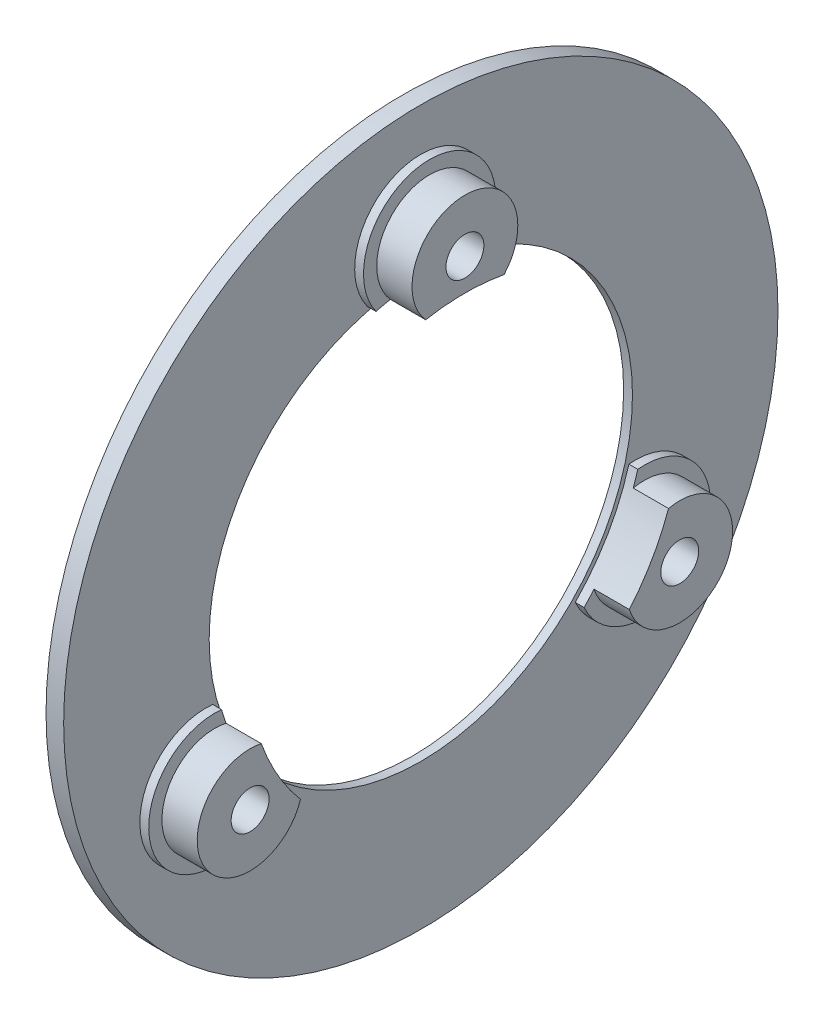
ISO-10303-21;
HEADER;
FILE_DESCRIPTION(('STEP AP214'),'2;1');
FILE_NAME('part.step','',(''),(''),'','','');
FILE_SCHEMA(('AUTOMOTIVE_DESIGN { 1 0 10303 214 1 1 1 1 }'));
ENDSEC;
DATA;
#1=APPLICATION_CONTEXT('core data for automotive mechanical design processes');
#2=APPLICATION_PROTOCOL_DEFINITION('international standard','automotive_design',2000,#1);
#3=PRODUCT_CONTEXT('',#1,'mechanical');
#4=PRODUCT('Part','Part','',(#3));
#5=PRODUCT_RELATED_PRODUCT_CATEGORY('part','',(#4));
#6=PRODUCT_DEFINITION_FORMATION('','',#4);
#7=PRODUCT_DEFINITION_CONTEXT('part definition',#1,'design');
#8=PRODUCT_DEFINITION('design','',#6,#7);
#9=PRODUCT_DEFINITION_SHAPE('','',#8);
#10=(LENGTH_UNIT() NAMED_UNIT(*) SI_UNIT(.MILLI.,.METRE.));
#11=(NAMED_UNIT(*) PLANE_ANGLE_UNIT() SI_UNIT($,.RADIAN.));
#12=(NAMED_UNIT(*) SI_UNIT($,.STERADIAN.) SOLID_ANGLE_UNIT());
#13=UNCERTAINTY_MEASURE_WITH_UNIT(LENGTH_MEASURE(1.E-05),#10,'distance_accuracy_value','');
#14=(GEOMETRIC_REPRESENTATION_CONTEXT(3) GLOBAL_UNCERTAINTY_ASSIGNED_CONTEXT((#13)) GLOBAL_UNIT_ASSIGNED_CONTEXT((#10,
#11,#12)) REPRESENTATION_CONTEXT('',''));
#15=CARTESIAN_POINT('',(0.,0.,0.));
#16=DIRECTION('',(0.,0.,1.));
#17=DIRECTION('',(1.,0.,0.));
#18=AXIS2_PLACEMENT_3D('',#15,#16,#17);
#19=CARTESIAN_POINT('',(-68.2964645562817,0.,0.));
#20=DIRECTION('',(1.,0.,0.));
#21=DIRECTION('',(0.,0.,-1.));
#22=AXIS2_PLACEMENT_3D('',#19,#20,#21);
#23=CYLINDRICAL_SURFACE('',#22,24.);
#24=CARTESIAN_POINT('',(1.,0.,0.));
#25=DIRECTION('',(1.,0.,0.));
#26=DIRECTION('',(0.,0.,-1.));
#27=AXIS2_PLACEMENT_3D('',#24,#25,#26);
#28=CIRCLE('',#27,24.);
#29=CARTESIAN_POINT('',(1.,0.,-24.));
#30=VERTEX_POINT('',#29);
#31=EDGE_CURVE('E371',#30,#30,#28,.F.);
#32=ORIENTED_EDGE('',*,*,#31,.T.);
#33=EDGE_LOOP('',(#32));
#34=FACE_BOUND('',#33,.T.);
#35=CARTESIAN_POINT('',(2.,0.,0.));
#36=DIRECTION('',(1.,0.,0.));
#37=DIRECTION('',(0.,0.,-1.));
#38=AXIS2_PLACEMENT_3D('',#35,#36,#37);
#39=CIRCLE('',#38,24.);
#40=CARTESIAN_POINT('',(2.,0.,-24.));
#41=VERTEX_POINT('',#40);
#42=EDGE_CURVE('E276',#41,#41,#39,.F.);
#43=ORIENTED_EDGE('',*,*,#42,.F.);
#44=EDGE_LOOP('',(#43));
#45=FACE_BOUND('',#44,.T.);
#46=ADVANCED_FACE('F158',(#34,#45),#23,.F.);
#47=CARTESIAN_POINT('',(3.,14.0625,0.));
#48=DIRECTION('',(1.,0.,0.));
#49=DIRECTION('',(0.,0.,-1.));
#50=AXIS2_PLACEMENT_3D('',#47,#48,#49);
#51=PLANE('',#50);
#52=CARTESIAN_POINT('',(3.,-14.0625,-24.3569644814373));
#53=DIRECTION('',(1.,0.,0.));
#54=DIRECTION('',(0.,0.,-1.));
#55=AXIS2_PLACEMENT_3D('',#52,#53,#54);
#56=CIRCLE('',#55,7.50000000000014);
#57=CARTESIAN_POINT('',(3.,-17.1321904151749,-17.5139387796746));
#58=VERTEX_POINT('',#57);
#59=CARTESIAN_POINT('',(3.,-6.6014206959362,-23.593881511851));
#60=VERTEX_POINT('',#59);
#61=EDGE_CURVE('E299',#58,#60,#56,.T.);
#62=ORIENTED_EDGE('',*,*,#61,.T.);
#63=CARTESIAN_POINT('',(3.,0.,0.));
#64=DIRECTION('',(1.,0.,0.));
#65=DIRECTION('',(0.,0.,-1.));
#66=AXIS2_PLACEMENT_3D('',#63,#64,#65);
#67=CIRCLE('',#66,24.5);
#68=CARTESIAN_POINT('',(3.,-8.19830874252486,-23.0876099621039));
#69=VERTEX_POINT('',#68);
#70=EDGE_CURVE('E452',#60,#69,#67,.F.);
#71=ORIENTED_EDGE('',*,*,#70,.T.);
#72=CARTESIAN_POINT('',(3.,-14.0625,-24.3569644814373));
#73=DIRECTION('',(1.,0.,0.));
#74=DIRECTION('',(0.,0.,-1.));
#75=AXIS2_PLACEMENT_3D('',#72,#73,#74);
#76=CIRCLE('',#75,6.);
#77=CARTESIAN_POINT('',(3.,-15.8953023685863,-18.6437486201465));
#78=VERTEX_POINT('',#77);
#79=EDGE_CURVE('E296',#78,#69,#76,.T.);
#80=ORIENTED_EDGE('',*,*,#79,.F.);
#81=EDGE_CURVE('E455',#78,#58,#67,.F.);
#82=ORIENTED_EDGE('',*,*,#81,.T.);
#83=EDGE_LOOP('',(#62,#71,#80,#82));
#84=FACE_BOUND('',#83,.T.);
#85=ADVANCED_FACE('F422',(#84),#51,.T.);
#86=CARTESIAN_POINT('',(3.,-14.0625,24.3569644814373));
#87=DIRECTION('',(1.,0.,0.));
#88=DIRECTION('',(0.,0.,-1.));
#89=AXIS2_PLACEMENT_3D('',#86,#87,#88);
#90=CIRCLE('',#89,7.50000000000028);
#91=CARTESIAN_POINT('',(3.,-6.60142069593605,23.5938815118511));
#92=VERTEX_POINT('',#91);
#93=CARTESIAN_POINT('',(3.,-17.132190415175,17.5139387796745));
#94=VERTEX_POINT('',#93);
#95=EDGE_CURVE('E460',#92,#94,#90,.T.);
#96=ORIENTED_EDGE('',*,*,#95,.T.);
#97=CARTESIAN_POINT('',(3.,-15.8953023685863,18.6437486201465));
#98=VERTEX_POINT('',#97);
#99=EDGE_CURVE('E480',#94,#98,#67,.F.);
#100=ORIENTED_EDGE('',*,*,#99,.T.);
#101=CARTESIAN_POINT('',(3.,-14.0625,24.3569644814373));
#102=DIRECTION('',(1.,0.,0.));
#103=DIRECTION('',(0.,0.,-1.));
#104=AXIS2_PLACEMENT_3D('',#101,#102,#103);
#105=CIRCLE('',#104,6.);
#106=CARTESIAN_POINT('',(3.,-8.19830874252487,23.0876099621039));
#107=VERTEX_POINT('',#106);
#108=EDGE_CURVE('E454',#107,#98,#105,.T.);
#109=ORIENTED_EDGE('',*,*,#108,.F.);
#110=EDGE_CURVE('E481',#107,#92,#67,.F.);
#111=ORIENTED_EDGE('',*,*,#110,.T.);
#112=EDGE_LOOP('',(#96,#100,#109,#111));
#113=FACE_BOUND('',#112,.T.);
#114=ADVANCED_FACE('F550',(#113),#51,.T.);
#115=CARTESIAN_POINT('',(3.,28.125,0.));
#116=DIRECTION('',(1.,0.,0.));
#117=DIRECTION('',(0.,0.,-1.));
#118=AXIS2_PLACEMENT_3D('',#115,#116,#117);
#119=CIRCLE('',#118,7.5);
#120=CARTESIAN_POINT('',(3.,23.7336111111111,-6.07994273217628));
#121=VERTEX_POINT('',#120);
#122=CARTESIAN_POINT('',(3.,23.7336111111111,6.07994273217628));
#123=VERTEX_POINT('',#122);
#124=EDGE_CURVE('E284',#121,#123,#119,.T.);
#125=ORIENTED_EDGE('',*,*,#124,.T.);
#126=CARTESIAN_POINT('',(3.,24.0936111111111,4.44386134195738));
#127=VERTEX_POINT('',#126);
#128=EDGE_CURVE('E450',#123,#127,#67,.F.);
#129=ORIENTED_EDGE('',*,*,#128,.T.);
#130=CARTESIAN_POINT('',(3.,28.125,0.));
#131=DIRECTION('',(1.,0.,0.));
#132=DIRECTION('',(0.,0.,-1.));
#133=AXIS2_PLACEMENT_3D('',#130,#131,#132);
#134=CIRCLE('',#133,6.);
#135=CARTESIAN_POINT('',(3.,24.0936111111111,-4.44386134195738));
#136=VERTEX_POINT('',#135);
#137=EDGE_CURVE('E290',#136,#127,#134,.T.);
#138=ORIENTED_EDGE('',*,*,#137,.F.);
#139=EDGE_CURVE('E448',#136,#121,#67,.F.);
#140=ORIENTED_EDGE('',*,*,#139,.T.);
#141=EDGE_LOOP('',(#125,#129,#138,#140));
#142=FACE_BOUND('',#141,.T.);
#143=ADVANCED_FACE('F442',(#142),#51,.T.);
#144=CARTESIAN_POINT('',(2.,0.,0.));
#145=DIRECTION('',(1.,0.,0.));
#146=DIRECTION('',(0.,0.,-1.));
#147=AXIS2_PLACEMENT_3D('',#144,#145,#146);
#148=PLANE('',#147);
#149=CARTESIAN_POINT('',(2.,28.125,0.));
#150=DIRECTION('',(1.,0.,0.));
#151=DIRECTION('',(0.,0.,-1.));
#152=AXIS2_PLACEMENT_3D('',#149,#150,#151);
#153=CIRCLE('',#152,7.5);
#154=CARTESIAN_POINT('',(2.,23.7336111111111,-6.07994273217628));
#155=VERTEX_POINT('',#154);
#156=CARTESIAN_POINT('',(2.,23.7336111111111,6.07994273217628));
#157=VERTEX_POINT('',#156);
#158=EDGE_CURVE('E282',#155,#157,#153,.T.);
#159=ORIENTED_EDGE('',*,*,#158,.F.);
#160=CARTESIAN_POINT('',(2.,0.,0.));
#161=DIRECTION('',(1.,0.,0.));
#162=DIRECTION('',(0.,0.,-1.));
#163=AXIS2_PLACEMENT_3D('',#160,#161,#162);
#164=CIRCLE('',#163,24.5);
#165=EDGE_CURVE('E265',#155,#157,#164,.T.);
#166=ORIENTED_EDGE('',*,*,#165,.T.);
#167=EDGE_LOOP('',(#159,#166));
#168=FACE_BOUND('',#167,.T.);
#169=CARTESIAN_POINT('',(2.,-14.0625,24.3569644814373));
#170=DIRECTION('',(1.,0.,0.));
#171=DIRECTION('',(0.,0.,-1.));
#172=AXIS2_PLACEMENT_3D('',#169,#170,#171);
#173=CIRCLE('',#172,7.50000000000028);
#174=CARTESIAN_POINT('',(2.,-6.60142069593605,23.5938815118511));
#175=VERTEX_POINT('',#174);
#176=CARTESIAN_POINT('',(2.,-17.132190415175,17.5139387796745));
#177=VERTEX_POINT('',#176);
#178=EDGE_CURVE('E289',#175,#177,#173,.T.);
#179=ORIENTED_EDGE('',*,*,#178,.F.);
#180=EDGE_CURVE('E277',#175,#177,#164,.T.);
#181=ORIENTED_EDGE('',*,*,#180,.T.);
#182=EDGE_LOOP('',(#179,#181));
#183=FACE_BOUND('',#182,.T.);
#184=CARTESIAN_POINT('',(2.,0.,0.));
#185=DIRECTION('',(1.,0.,0.));
#186=DIRECTION('',(0.,0.,-1.));
#187=AXIS2_PLACEMENT_3D('',#184,#185,#186);
#188=CIRCLE('',#187,40.5);
#189=CARTESIAN_POINT('',(2.,0.,-40.5));
#190=VERTEX_POINT('',#189);
#191=EDGE_CURVE('E354',#190,#190,#188,.T.);
#192=ORIENTED_EDGE('',*,*,#191,.T.);
#193=EDGE_LOOP('',(#192));
#194=FACE_BOUND('',#193,.T.);
#195=CARTESIAN_POINT('',(2.,-17.1321904151749,-17.5139387796746));
#196=VERTEX_POINT('',#195);
#197=CARTESIAN_POINT('',(2.,-6.60142069593619,-23.593881511851));
#198=VERTEX_POINT('',#197);
#199=EDGE_CURVE('E175',#196,#198,#164,.T.);
#200=ORIENTED_EDGE('',*,*,#199,.T.);
#201=CARTESIAN_POINT('',(2.,-14.0625,-24.3569644814373));
#202=DIRECTION('',(1.,0.,0.));
#203=DIRECTION('',(0.,0.,-1.));
#204=AXIS2_PLACEMENT_3D('',#201,#202,#203);
#205=CIRCLE('',#204,7.50000000000014);
#206=EDGE_CURVE('E293',#196,#198,#205,.T.);
#207=ORIENTED_EDGE('',*,*,#206,.F.);
#208=EDGE_LOOP('',(#200,#207));
#209=FACE_BOUND('',#208,.T.);
#210=ORIENTED_EDGE('',*,*,#42,.T.);
#211=EDGE_LOOP('',(#210));
#212=FACE_BOUND('',#211,.T.);
#213=ADVANCED_FACE('F287',(#168,#183,#194,#209,#212),#148,.T.);
#214=CARTESIAN_POINT('',(3.,0.,0.));
#215=DIRECTION('',(-1.,0.,0.));
#216=DIRECTION('',(0.,0.,1.));
#217=AXIS2_PLACEMENT_3D('',#214,#215,#216);
#218=CYLINDRICAL_SURFACE('',#217,40.5);
#219=CARTESIAN_POINT('',(0.,0.,0.));
#220=DIRECTION('',(-1.,0.,0.));
#221=DIRECTION('',(0.,0.,1.));
#222=AXIS2_PLACEMENT_3D('',#219,#220,#221);
#223=CIRCLE('',#222,40.5);
#224=CARTESIAN_POINT('',(0.,0.,40.5));
#225=VERTEX_POINT('',#224);
#226=EDGE_CURVE('E374',#225,#225,#223,.T.);
#227=ORIENTED_EDGE('',*,*,#226,.F.);
#228=EDGE_LOOP('',(#227));
#229=FACE_BOUND('',#228,.T.);
#230=ORIENTED_EDGE('',*,*,#191,.F.);
#231=EDGE_LOOP('',(#230));
#232=FACE_BOUND('',#231,.T.);
#233=ADVANCED_FACE('F419',(#229,#232),#218,.T.);
#234=CARTESIAN_POINT('',(0.999999999999998,28.125,0.));
#235=DIRECTION('',(-1.,0.,0.));
#236=DIRECTION('',(0.,0.,1.));
#237=AXIS2_PLACEMENT_3D('',#234,#235,#236);
#238=CONICAL_SURFACE('',#237,3.15,0.785398163397452);
#239=CARTESIAN_POINT('',(0.999999999999998,28.125,0.));
#240=DIRECTION('',(-1.,0.,0.));
#241=DIRECTION('',(0.,0.,1.));
#242=AXIS2_PLACEMENT_3D('',#239,#240,#241);
#243=CIRCLE('',#242,3.15);
#244=CARTESIAN_POINT('',(0.999999999999998,28.4694363506901,-3.13111219861622));
#245=VERTEX_POINT('',#244);
#246=CARTESIAN_POINT('',(0.999999999999998,28.4694363506901,3.13111219861622));
#247=VERTEX_POINT('',#246);
#248=EDGE_CURVE('E369',#245,#247,#243,.T.);
#249=ORIENTED_EDGE('',*,*,#248,.T.);
#250=CARTESIAN_POINT('',(0.999999999999998,28.4694363506901,3.13111219861622));
#251=CARTESIAN_POINT('',(1.00001380500847,28.583681570066,3.11855716344337));
#252=CARTESIAN_POINT('',(0.998112234272037,28.6974429138037,3.10160114914846));
#253=CARTESIAN_POINT('',(0.990768358426493,28.923194948904,3.05888422252965));
#254=CARTESIAN_POINT('',(0.985325713704853,29.0351854693776,3.03312246578904));
#255=CARTESIAN_POINT('',(0.971168145233079,29.2569101140088,2.97270103761833));
#256=CARTESIAN_POINT('',(0.962443239756576,29.3666362672303,2.93801432713111));
#257=CARTESIAN_POINT('',(0.942121955381928,29.5826110210118,2.85988619102815));
#258=CARTESIAN_POINT('',(0.930525752332747,29.6888598340861,2.81644530158128));
#259=CARTESIAN_POINT('',(0.892161000868774,30.0005381921529,2.67343831996709));
#260=CARTESIAN_POINT('',(0.861753146041542,30.1997957692748,2.56094561763914));
#261=CARTESIAN_POINT('',(0.795608634660209,30.5742918975488,2.30292869395017));
#262=CARTESIAN_POINT('',(0.759880807114151,30.7495693383626,2.15745899599032));
#263=CARTESIAN_POINT('',(0.697028015709318,31.0305355818927,1.87350324428061));
#264=CARTESIAN_POINT('',(0.669877283801453,31.1428614410229,1.74157984739593));
#265=CARTESIAN_POINT('',(0.618563056945739,31.3446885448844,1.46075355473588));
#266=CARTESIAN_POINT('',(0.594395778260166,31.4342188562958,1.31187263591662));
#267=CARTESIAN_POINT('',(0.555708637327163,31.5729899816208,1.02520313510999));
#268=CARTESIAN_POINT('',(0.540257578296324,31.626424087178,0.889578509111102));
#269=CARTESIAN_POINT('',(0.515513066896302,31.710699699624,0.610933215674344));
#270=CARTESIAN_POINT('',(0.506214793337803,31.7415588977268,0.467918433969418));
#271=CARTESIAN_POINT('',(0.495027793744182,31.7785772886529,0.17782134801673));
#272=CARTESIAN_POINT('',(0.493167961709596,31.7846401643012,0.0307254128160566));
#273=CARTESIAN_POINT('',(0.497220525371092,31.7713053162351,-0.262201341293231));
#274=CARTESIAN_POINT('',(0.503133822455441,31.7519046397145,-0.408032011505));
#275=CARTESIAN_POINT('',(0.521297103410972,31.691050940398,-0.685297206949073));
#276=CARTESIAN_POINT('',(0.533146136101902,31.6509890396641,-0.817070746549158));
#277=CARTESIAN_POINT('',(0.561580415251426,31.552034410032,-1.07275209888613));
#278=CARTESIAN_POINT('',(0.578167169944071,31.4931356837932,-1.1966573914212));
#279=CARTESIAN_POINT('',(0.616435784073487,31.3519396755224,-1.44755494352242));
#280=CARTESIAN_POINT('',(0.638473079037711,31.2678119539553,-1.57345647106191));
#281=CARTESIAN_POINT('',(0.684301207452613,31.0830096936256,-1.81204997712274));
#282=CARTESIAN_POINT('',(0.708092945862467,30.9823265820344,-1.92473505974161));
#283=CARTESIAN_POINT('',(0.760277838502666,30.7457756179439,-2.15722879832492));
#284=CARTESIAN_POINT('',(0.788642942931276,30.6068947228454,-2.27398055997133));
#285=CARTESIAN_POINT('',(0.842416423796797,30.3133916115499,-2.48660709168099));
#286=CARTESIAN_POINT('',(0.867821979389588,30.1587546366021,-2.5824620188752));
#287=CARTESIAN_POINT('',(0.917074223950825,29.8108629126181,-2.76654672686862));
#288=CARTESIAN_POINT('',(0.939979264537465,29.6154372607755,-2.85093726046916));
#289=CARTESIAN_POINT('',(0.975579829148289,29.2134577325249,-2.9894725342782));
#290=CARTESIAN_POINT('',(0.988288245636486,29.0069182621654,-3.04365544202198));
#291=CARTESIAN_POINT('',(0.996549660583563,28.7432216209889,-3.09275474051422));
#292=CARTESIAN_POINT('',(0.997838450591641,28.6886309673968,-3.10185666827132));
#293=CARTESIAN_POINT('',(0.999562457980969,28.5792147439483,-3.11801032802251));
#294=CARTESIAN_POINT('',(0.99999891329306,28.5243896308678,-3.12506502071302));
#295=CARTESIAN_POINT('',(1.,28.4694363506901,-3.13111219861622));
#296=B_SPLINE_CURVE_WITH_KNOTS('',3,(#250,#251,#252,#253,#254,#255,#256,#257,#258,#259,#260,
#261,#262,#263,#264,#265,#266,#267,#268,#269,#270,#271,#272,#273,#274,#275,#276,#277,#278,#279,
#280,#281,#282,#283,#284,#285,#286,#287,#288,#289,#290,#291,#292,#293,#294,#295),.UNSPECIFIED.,
.F.,.F.,(4,2,2,2,2,2,2,2,2,2,2,2,2,2,2,2,2,2,2,2,2,2,4),(0.,0.344696612519978,0.689426288609634,
1.0352129145783,1.3809783685213,2.06975437244225,2.75739977017232,3.28155377577046,
3.80503604537935,4.24296195992438,4.68054431758441,5.11982478583598,5.55915619846098,
5.97216126599358,6.38529795878495,6.84268338259813,7.30030640317082,7.84914235857066,
8.39849722017958,9.03809536857986,9.676883538288,9.8429341136358,10.0087433372455),.UNSPECIFIED.);
#297=EDGE_CURVE('E168',#247,#245,#296,.T.);
#298=ORIENTED_EDGE('',*,*,#297,.T.);
#299=EDGE_LOOP('',(#249,#298));
#300=FACE_BOUND('',#299,.T.);
#301=CARTESIAN_POINT('',(2.,28.125,0.));
#302=DIRECTION('',(1.,0.,0.));
#303=DIRECTION('',(0.,0.,-1.));
#304=AXIS2_PLACEMENT_3D('',#301,#302,#303);
#305=CIRCLE('',#304,2.14999999999999);
#306=CARTESIAN_POINT('',(2.,28.125,-2.14999999999999));
#307=VERTEX_POINT('',#306);
#308=EDGE_CURVE('E360',#307,#307,#305,.F.);
#309=ORIENTED_EDGE('',*,*,#308,.F.);
#310=EDGE_LOOP('',(#309));
#311=FACE_BOUND('',#310,.T.);
#312=ADVANCED_FACE('F410',(#300,#311),#238,.F.);
#313=CARTESIAN_POINT('',(0.999999999999998,-14.0625000000001,-24.3569644814373));
#314=DIRECTION('',(-1.,0.,0.));
#315=DIRECTION('',(0.,0.,1.));
#316=AXIS2_PLACEMENT_3D('',#313,#314,#315);
#317=CONICAL_SURFACE('',#316,3.15,0.785398163397453);
#318=CARTESIAN_POINT('',(0.999999999999998,-14.0625000000001,-24.3569644814373));
#319=DIRECTION('',(-1.,0.,0.));
#320=DIRECTION('',(0.,0.,1.));
#321=AXIS2_PLACEMENT_3D('',#318,#319,#320);
#322=CIRCLE('',#321,3.15);
#323=CARTESIAN_POINT('',(0.999999999999998,-16.9463408814461,-23.0896990118135));
#324=VERTEX_POINT('',#323);
#325=CARTESIAN_POINT('',(0.999999999999998,-11.5230954692442,-26.2208112104298));
#326=VERTEX_POINT('',#325);
#327=EDGE_CURVE('E366',#324,#326,#322,.T.);
#328=ORIENTED_EDGE('',*,*,#327,.T.);
#329=CARTESIAN_POINT('',(0.999999999999998,-11.5230954692442,-26.2208112104298));
#330=CARTESIAN_POINT('',(1.00001380500847,-11.5910910583372,-26.3134729550839));
#331=CARTESIAN_POINT('',(0.998112234272038,-11.6626560693324,-26.4035151615819));
#332=CARTESIAN_POINT('',(0.990768358426493,-11.812526030506,-26.5776636956254));
#333=CARTESIAN_POINT('',(0.985325713704853,-11.8908316265263,-26.6617694529683));
#334=CARTESIAN_POINT('',(0.971168145233079,-12.0540204405707,-26.8235779137786));
#335=CARTESIAN_POINT('',(0.962443239756575,-12.1389230896371,-26.9012601946843));
#336=CARTESIAN_POINT('',(0.942121955381929,-12.3145714171433,-27.0492357499837));
#337=CARTESIAN_POINT('',(0.930525752332749,-12.4053167375045,-27.1195294765046));
#338=CARTESIAN_POINT('',(0.892161000868777,-12.6850035955343,-27.3179473615932));
#339=CARTESIAN_POINT('',(0.861753146041544,-12.8820539220516,-27.4342631341133));
#340=CARTESIAN_POINT('',(0.795608634660209,-13.2927511967096,-27.629577832973));
#341=CARTESIAN_POINT('',(0.759880807114151,-13.5063703710305,-27.7086377004482));
#342=CARTESIAN_POINT('',(0.697028015709317,-13.8927663873269,-27.8099837290963));
#343=CARTESIAN_POINT('',(0.669877283801451,-14.0631783299477,-27.8412990781626));
#344=CARTESIAN_POINT('',(0.618563056945735,-14.4072945853726,-27.8756733309488));
#345=CARTESIAN_POINT('',(0.594395778260162,-14.5809943989146,-27.8787683956302));
#346=CARTESIAN_POINT('',(0.555708637327159,-14.8986430317658,-27.8556129650701));
#347=CARTESIAN_POINT('',(0.54025757829632,-15.0428144560382,-27.8340759449117));
#348=CARTESIAN_POINT('',(0.515513066896298,-15.3262661650224,-27.7677381194911));
#349=CARTESIAN_POINT('',(0.506214793337801,-15.465550198147,-27.7229555781361));
#350=CARTESIAN_POINT('',(0.49502779374418,-15.7352908396089,-27.6099659021089));
#351=CARTESIAN_POINT('',(0.493167961709594,-15.8657110941103,-27.54166853884));
#352=CARTESIAN_POINT('',(0.497220525371089,-16.112725680584,-27.3836568446045));
#353=CARTESIAN_POINT('',(0.503133822455436,-16.2293184073779,-27.2939400307811));
#354=CARTESIAN_POINT('',(0.521297103410964,-16.4390102605595,-27.1026065835368));
#355=CARTESIAN_POINT('',(0.533146136101894,-16.5330985430328,-27.0020251899773));
#356=CARTESIAN_POINT('',(0.56158041525142,-16.7050477746146,-26.7884872907253));
#357=CARTESIAN_POINT('',(0.578167169944068,-16.7829035424939,-26.6755268512845));
#358=CARTESIAN_POINT('',(0.616435784073484,-16.9295891922255,-26.4277987451584));
#359=CARTESIAN_POINT('',(0.638473079037706,-16.9965592526664,-26.2919912373491));
#360=CARTESIAN_POINT('',(0.684301207452607,-17.1107861599282,-26.0126510321963));
#361=CARTESIAN_POINT('',(0.708092945862462,-17.1580327483081,-25.8691143585169));
#362=CARTESIAN_POINT('',(0.760277838502663,-17.2411027500969,-25.5480083450331));
#363=CARTESIAN_POINT('',(0.788642942931273,-17.27277229407,-25.3693580809543));
#364=CARTESIAN_POINT('',(0.842416423796795,-17.3101607164013,-25.0088636646277));
#365=CARTESIAN_POINT('',(0.867821979389585,-17.3158550309555,-24.8270166523615));
#366=CARTESIAN_POINT('',(0.917074223950823,-17.3013312025341,-24.4336912276283));
#367=CARTESIAN_POINT('',(0.939979264537464,-17.2767027225498,-24.2222523817812));
#368=CARTESIAN_POINT('',(0.975579829148288,-17.1956880248634,-23.8048602616104));
#369=CARTESIAN_POINT('',(0.988288245636484,-17.1393420642406,-23.598900379523));
#370=CARTESIAN_POINT('',(0.996549660583562,-17.0500149834546,-23.3459827401254));
#371=CARTESIAN_POINT('',(0.997838450591641,-17.0306021573196,-23.2941548834268));
#372=CARTESIAN_POINT('',(0.999562457980969,-16.989883525304,-23.1913208244587));
#373=CARTESIAN_POINT('',(0.999998913293061,-16.9685805118496,-23.1403135374204));
#374=CARTESIAN_POINT('',(1.,-16.9463408814461,-23.0896990118135));
#375=B_SPLINE_CURVE_WITH_KNOTS('',3,(#329,#330,#331,#332,#333,#334,#335,#336,#337,#338,#339,
#340,#341,#342,#343,#344,#345,#346,#347,#348,#349,#350,#351,#352,#353,#354,#355,#356,#357,#358,
#359,#360,#361,#362,#363,#364,#365,#366,#367,#368,#369,#370,#371,#372,#373,#374),.UNSPECIFIED.,
.F.,.F.,(4,2,2,2,2,2,2,2,2,2,2,2,2,2,2,2,2,2,2,2,2,2,4),(0.,0.344696612519974,0.689426288609631,
1.03521291457829,1.3809783685213,2.06975437244225,2.75739977017232,3.28155377577046,
3.80503604537935,4.24296195992439,4.68054431758442,5.11982478583599,5.55915619846098,
5.97216126599359,6.38529795878496,6.84268338259813,7.30030640317083,7.84914235857067,
8.39849722017958,9.03809536857986,9.676883538288,9.84293411363582,10.0087433372456),.UNSPECIFIED.);
#376=EDGE_CURVE('E12',#326,#324,#375,.T.);
#377=ORIENTED_EDGE('',*,*,#376,.T.);
#378=EDGE_LOOP('',(#328,#377));
#379=FACE_BOUND('',#378,.T.);
#380=CARTESIAN_POINT('',(2.,-14.0625000000001,-24.3569644814373));
#381=DIRECTION('',(1.,0.,0.));
#382=DIRECTION('',(0.,0.,-1.));
#383=AXIS2_PLACEMENT_3D('',#380,#381,#382);
#384=CIRCLE('',#383,2.14999999999999);
#385=CARTESIAN_POINT('',(2.,-14.0625000000001,-26.5069644814373));
#386=VERTEX_POINT('',#385);
#387=EDGE_CURVE('E357',#386,#386,#384,.F.);
#388=ORIENTED_EDGE('',*,*,#387,.F.);
#389=EDGE_LOOP('',(#388));
#390=FACE_BOUND('',#389,.T.);
#391=ADVANCED_FACE('F405',(#379,#390),#317,.F.);
#392=CARTESIAN_POINT('',(0.999999999999998,-14.0624999999998,24.3569644814375));
#393=DIRECTION('',(-1.,0.,0.));
#394=DIRECTION('',(0.,0.,1.));
#395=AXIS2_PLACEMENT_3D('',#392,#393,#394);
#396=CONICAL_SURFACE('',#395,3.15,0.785398163397453);
#397=CARTESIAN_POINT('',(0.999999999999998,-14.0624999999998,24.3569644814375));
#398=DIRECTION('',(-1.,0.,0.));
#399=DIRECTION('',(0.,0.,1.));
#400=AXIS2_PLACEMENT_3D('',#397,#398,#399);
#401=CIRCLE('',#400,3.15);
#402=CARTESIAN_POINT('',(0.999999999999998,-11.5230954692438,26.2208112104299));
#403=VERTEX_POINT('',#402);
#404=CARTESIAN_POINT('',(0.999999999999998,-16.9463408814458,23.0896990118138));
#405=VERTEX_POINT('',#404);
#406=EDGE_CURVE('E363',#403,#405,#401,.T.);
#407=ORIENTED_EDGE('',*,*,#406,.T.);
#408=CARTESIAN_POINT('',(0.999999999999998,-16.9463408814458,23.0896990118138));
#409=CARTESIAN_POINT('',(1.00001380500847,-16.9925905117287,23.1949157916407));
#410=CARTESIAN_POINT('',(0.998112234272037,-17.0347868444712,23.3019140124336));
#411=CARTESIAN_POINT('',(0.990768358426492,-17.1106689183979,23.5187794730959));
#412=CARTESIAN_POINT('',(0.985325713704852,-17.1443538428512,23.6286469871794));
#413=CARTESIAN_POINT('',(0.971168145233078,-17.202889673438,23.8508768761605));
#414=CARTESIAN_POINT('',(0.962443239756575,-17.2277131775931,23.9632458675534));
#415=CARTESIAN_POINT('',(0.942121955381929,-17.2680396038684,24.1893495589558));
#416=CARTESIAN_POINT('',(0.930525752332749,-17.2835430965815,24.3030841749235));
#417=CARTESIAN_POINT('',(0.892161000868776,-17.3155345966185,24.6445090416263));
#418=CARTESIAN_POINT('',(0.861753146041541,-17.3177418472231,24.8733175164744));
#419=CARTESIAN_POINT('',(0.795608634660207,-17.2815407008391,25.3266491390231));
#420=CARTESIAN_POINT('',(0.759880807114152,-17.243198967332,25.5511787044581));
#421=CARTESIAN_POINT('',(0.697028015709318,-17.1377691945657,25.9364804848159));
#422=CARTESIAN_POINT('',(0.669877283801453,-17.0796831110751,26.0997192307668));
#423=CARTESIAN_POINT('',(0.618563056945736,-16.9373939595116,26.4149197762132));
#424=CARTESIAN_POINT('',(0.594395778260163,-16.8532244573811,26.5668957597138));
#425=CARTESIAN_POINT('',(0.555708637327161,-16.6743469498548,26.8304098299603));
#426=CARTESIAN_POINT('',(0.540257578296322,-16.5836096311396,26.9444974358008));
#427=CARTESIAN_POINT('',(0.5155130668963,-16.3844335346014,27.1568049038169));
#428=CARTESIAN_POINT('',(0.506214793337802,-16.2760086995797,27.2550371441669));
#429=CARTESIAN_POINT('',(0.49502779374418,-16.0432864490439,27.4321445540924));
#430=CARTESIAN_POINT('',(0.493167961709595,-15.9189290701908,27.5109431260242));
#431=CARTESIAN_POINT('',(0.497220525371092,-15.658579635651,27.645858185898));
#432=CARTESIAN_POINT('',(0.50313382245544,-15.5225862323364,27.7019720422864));
#433=CARTESIAN_POINT('',(0.521297103410969,-15.2520406798383,27.7879037904861));
#434=CARTESIAN_POINT('',(0.533146136101899,-15.1178904966311,27.8190959365266));
#435=CARTESIAN_POINT('',(0.561580415251424,-14.8469866354173,27.8612393896117));
#436=CARTESIAN_POINT('',(0.578167169944071,-14.7102321412992,27.8721842427059));
#437=CARTESIAN_POINT('',(0.616435784073487,-14.4223504832968,27.875353688681));
#438=CARTESIAN_POINT('',(0.63847307903771,-14.2712527012888,27.8654477084112));
#439=CARTESIAN_POINT('',(0.684301207452611,-13.9722235336972,27.8247010093192));
#440=CARTESIAN_POINT('',(0.708092945862466,-13.8242938337262,27.7938494182587));
#441=CARTESIAN_POINT('',(0.760277838502667,-13.504672867847,27.7052371433582));
#442=CARTESIAN_POINT('',(0.788642942931276,-13.3341224287753,27.6433386409258));
#443=CARTESIAN_POINT('',(0.842416423796797,-13.0032308951484,27.4954707563089));
#444=CARTESIAN_POINT('',(0.867821979389587,-12.8428996056464,27.4094786712369));
#445=CARTESIAN_POINT('',(0.917074223950825,-12.5095317100839,27.2002379544971));
#446=CARTESIAN_POINT('',(0.939979264537465,-12.3387345382256,27.0731896422505));
#447=CARTESIAN_POINT('',(0.97557982914829,-12.0177697076614,26.7943327958888));
#448=CARTESIAN_POINT('',(0.988288245636486,-11.8675761979247,26.6425558215451));
#449=CARTESIAN_POINT('',(0.996549660583563,-11.6932066375342,26.4387374806398));
#450=CARTESIAN_POINT('',(0.997838450591642,-11.658028810077,26.3960115516983));
#451=CARTESIAN_POINT('',(0.999562457980969,-11.5893312186442,26.3093311524814));
#452=CARTESIAN_POINT('',(0.99999891329306,-11.555809119018,26.2653785581336));
#453=CARTESIAN_POINT('',(1.,-11.5230954692438,26.2208112104299));
#454=B_SPLINE_CURVE_WITH_KNOTS('',3,(#408,#409,#410,#411,#412,#413,#414,#415,#416,#417,#418,
#419,#420,#421,#422,#423,#424,#425,#426,#427,#428,#429,#430,#431,#432,#433,#434,#435,#436,#437,
#438,#439,#440,#441,#442,#443,#444,#445,#446,#447,#448,#449,#450,#451,#452,#453),.UNSPECIFIED.,
.F.,.F.,(4,2,2,2,2,2,2,2,2,2,2,2,2,2,2,2,2,2,2,2,2,2,4),(0.,0.344696612519973,0.689426288609633,
1.03521291457829,1.3809783685213,2.06975437244226,2.75739977017232,3.28155377577046,
3.80503604537935,4.24296195992439,4.68054431758442,5.11982478583599,5.55915619846098,
5.97216126599359,6.38529795878495,6.84268338259813,7.30030640317083,7.84914235857067,
8.39849722017958,9.03809536857986,9.676883538288,9.84293411363581,10.0087433372456),.UNSPECIFIED.);
#455=EDGE_CURVE('E387',#405,#403,#454,.T.);
#456=ORIENTED_EDGE('',*,*,#455,.T.);
#457=EDGE_LOOP('',(#407,#456));
#458=FACE_BOUND('',#457,.T.);
#459=CARTESIAN_POINT('',(2.,-14.0624999999998,24.3569644814375));
#460=DIRECTION('',(1.,0.,0.));
#461=DIRECTION('',(0.,0.,-1.));
#462=AXIS2_PLACEMENT_3D('',#459,#460,#461);
#463=CIRCLE('',#462,2.14999999999999);
#464=CARTESIAN_POINT('',(2.,-14.0624999999998,22.2069644814375));
#465=VERTEX_POINT('',#464);
#466=EDGE_CURVE('E163',#465,#465,#463,.F.);
#467=ORIENTED_EDGE('',*,*,#466,.F.);
#468=EDGE_LOOP('',(#467));
#469=FACE_BOUND('',#468,.T.);
#470=ADVANCED_FACE('F399',(#458,#469),#396,.F.);
#471=CARTESIAN_POINT('',(0.,36.25,0.));
#472=DIRECTION('',(-1.,0.,0.));
#473=DIRECTION('',(0.,-1.,0.));
#474=AXIS2_PLACEMENT_3D('',#471,#472,#473);
#475=PLANE('',#474);
#476=CARTESIAN_POINT('',(0.,0.,0.));
#477=DIRECTION('',(-1.,0.,0.));
#478=DIRECTION('',(0.,0.,1.));
#479=AXIS2_PLACEMENT_3D('',#476,#477,#478);
#480=CIRCLE('',#479,33.);
#481=CARTESIAN_POINT('',(0.,0.,33.));
#482=VERTEX_POINT('',#481);
#483=EDGE_CURVE('E377',#482,#482,#480,.T.);
#484=ORIENTED_EDGE('',*,*,#483,.F.);
#485=EDGE_LOOP('',(#484));
#486=FACE_BOUND('',#485,.T.);
#487=ORIENTED_EDGE('',*,*,#226,.T.);
#488=EDGE_LOOP('',(#487));
#489=FACE_BOUND('',#488,.T.);
#490=ADVANCED_FACE('F404',(#486,#489),#475,.T.);
#491=CARTESIAN_POINT('',(1.,0.,0.));
#492=DIRECTION('',(1.,0.,0.));
#493=DIRECTION('',(0.,0.,-1.));
#494=AXIS2_PLACEMENT_3D('',#491,#492,#493);
#495=PLANE('',#494);
#496=ORIENTED_EDGE('',*,*,#327,.F.);
#497=CARTESIAN_POINT('',(1.,0.,0.));
#498=DIRECTION('',(1.,0.,0.));
#499=DIRECTION('',(0.,0.,-1.));
#500=AXIS2_PLACEMENT_3D('',#497,#498,#499);
#501=CIRCLE('',#500,28.6411010564593);
#502=EDGE_CURVE('E384',#324,#405,#501,.F.);
#503=ORIENTED_EDGE('',*,*,#502,.T.);
#504=ORIENTED_EDGE('',*,*,#406,.F.);
#505=CARTESIAN_POINT('',(1.,0.,0.));
#506=DIRECTION('',(1.,0.,0.));
#507=DIRECTION('',(0.,0.,-1.));
#508=AXIS2_PLACEMENT_3D('',#505,#506,#507);
#509=CIRCLE('',#508,28.6411010564593);
#510=EDGE_CURVE('E382',#403,#247,#509,.F.);
#511=ORIENTED_EDGE('',*,*,#510,.T.);
#512=ORIENTED_EDGE('',*,*,#248,.F.);
#513=CARTESIAN_POINT('',(1.,0.,0.));
#514=DIRECTION('',(1.,0.,0.));
#515=DIRECTION('',(0.,0.,-1.));
#516=AXIS2_PLACEMENT_3D('',#513,#514,#515);
#517=CIRCLE('',#516,28.6411010564593);
#518=EDGE_CURVE('E380',#245,#326,#517,.F.);
#519=ORIENTED_EDGE('',*,*,#518,.T.);
#520=EDGE_LOOP('',(#496,#503,#504,#511,#512,#519));
#521=FACE_BOUND('',#520,.T.);
#522=ORIENTED_EDGE('',*,*,#31,.F.);
#523=EDGE_LOOP('',(#522));
#524=FACE_BOUND('',#523,.T.);
#525=ADVANCED_FACE('F424',(#521,#524),#495,.F.);
#526=CARTESIAN_POINT('',(-9.,0.,0.));
#527=DIRECTION('',(-1.,0.,0.));
#528=DIRECTION('',(0.,0.,1.));
#529=AXIS2_PLACEMENT_3D('',#526,#527,#528);
#530=TOROIDAL_SURFACE('',#529,28.6411010564593,10.);
#531=ORIENTED_EDGE('',*,*,#455,.F.);
#532=ORIENTED_EDGE('',*,*,#502,.F.);
#533=ORIENTED_EDGE('',*,*,#376,.F.);
#534=ORIENTED_EDGE('',*,*,#518,.F.);
#535=ORIENTED_EDGE('',*,*,#297,.F.);
#536=ORIENTED_EDGE('',*,*,#510,.F.);
#537=EDGE_LOOP('',(#531,#532,#533,#534,#535,#536));
#538=FACE_BOUND('',#537,.T.);
#539=ORIENTED_EDGE('',*,*,#483,.T.);
#540=EDGE_LOOP('',(#539));
#541=FACE_BOUND('',#540,.T.);
#542=ADVANCED_FACE('F160',(#538,#541),#530,.F.);
#543=CARTESIAN_POINT('',(7.,0.,0.));
#544=DIRECTION('',(-1.,0.,0.));
#545=DIRECTION('',(0.,0.,1.));
#546=AXIS2_PLACEMENT_3D('',#543,#544,#545);
#547=CYLINDRICAL_SURFACE('',#546,24.5);
#548=DIRECTION('',(-1.,0.,0.));
#549=VECTOR('',#548,1.);
#550=CARTESIAN_POINT('',(7.,24.0936111111111,4.44386134195738));
#551=LINE('',#550,#549);
#552=CARTESIAN_POINT('',(7.,24.0936111111111,4.44386134195738));
#553=VERTEX_POINT('',#552);
#554=EDGE_CURVE('E349',#553,#127,#551,.T.);
#555=ORIENTED_EDGE('',*,*,#554,.T.);
#556=ORIENTED_EDGE('',*,*,#128,.F.);
#557=DIRECTION('',(-1.,0.,0.));
#558=VECTOR('',#557,1.);
#559=CARTESIAN_POINT('',(3.,23.7336111111111,6.07994273217628));
#560=LINE('',#559,#558);
#561=EDGE_CURVE('E272',#123,#157,#560,.T.);
#562=ORIENTED_EDGE('',*,*,#561,.T.);
#563=ORIENTED_EDGE('',*,*,#165,.F.);
#564=DIRECTION('',(-1.,0.,0.));
#565=VECTOR('',#564,1.);
#566=CARTESIAN_POINT('',(3.,23.7336111111111,-6.07994273217627));
#567=LINE('',#566,#565);
#568=EDGE_CURVE('E269',#121,#155,#567,.T.);
#569=ORIENTED_EDGE('',*,*,#568,.F.);
#570=ORIENTED_EDGE('',*,*,#139,.F.);
#571=DIRECTION('',(-1.,0.,0.));
#572=VECTOR('',#571,1.);
#573=CARTESIAN_POINT('',(7.,24.0936111111111,-4.44386134195737));
#574=LINE('',#573,#572);
#575=CARTESIAN_POINT('',(7.,24.0936111111111,-4.44386134195737));
#576=VERTEX_POINT('',#575);
#577=EDGE_CURVE('E351',#576,#136,#574,.T.);
#578=ORIENTED_EDGE('',*,*,#577,.F.);
#579=CARTESIAN_POINT('',(7.,0.,0.));
#580=DIRECTION('',(1.,0.,0.));
#581=DIRECTION('',(0.,0.,-1.));
#582=AXIS2_PLACEMENT_3D('',#579,#580,#581);
#583=CIRCLE('',#582,24.5);
#584=EDGE_CURVE('E341',#576,#553,#583,.T.);
#585=ORIENTED_EDGE('',*,*,#584,.T.);
#586=EDGE_LOOP('',(#555,#556,#562,#563,#569,#570,#578,#585));
#587=FACE_BOUND('',#586,.T.);
#588=ADVANCED_FACE('F268',(#587),#547,.F.);
#589=CARTESIAN_POINT('',(7.,28.125,0.));
#590=DIRECTION('',(-1.,0.,0.));
#591=DIRECTION('',(0.,0.,1.));
#592=AXIS2_PLACEMENT_3D('',#589,#590,#591);
#593=CYLINDRICAL_SURFACE('',#592,6.);
#594=ORIENTED_EDGE('',*,*,#577,.T.);
#595=ORIENTED_EDGE('',*,*,#137,.T.);
#596=ORIENTED_EDGE('',*,*,#554,.F.);
#597=CARTESIAN_POINT('',(7.,28.125,0.));
#598=DIRECTION('',(1.,0.,0.));
#599=DIRECTION('',(0.,0.,-1.));
#600=AXIS2_PLACEMENT_3D('',#597,#598,#599);
#601=CIRCLE('',#600,6.);
#602=EDGE_CURVE('E344',#576,#553,#601,.T.);
#603=ORIENTED_EDGE('',*,*,#602,.F.);
#604=EDGE_LOOP('',(#594,#595,#596,#603));
#605=FACE_BOUND('',#604,.T.);
#606=ADVANCED_FACE('F487',(#605),#593,.T.);
#607=CARTESIAN_POINT('',(7.,28.125,0.));
#608=DIRECTION('',(-1.,0.,0.));
#609=DIRECTION('',(0.,0.,1.));
#610=AXIS2_PLACEMENT_3D('',#607,#608,#609);
#611=CYLINDRICAL_SURFACE('',#610,2.14999999999999);
#612=CARTESIAN_POINT('',(7.,28.125,0.));
#613=DIRECTION('',(1.,0.,0.));
#614=DIRECTION('',(0.,0.,-1.));
#615=AXIS2_PLACEMENT_3D('',#612,#613,#614);
#616=CIRCLE('',#615,2.14999999999999);
#617=CARTESIAN_POINT('',(7.,28.125,-2.14999999999999));
#618=VERTEX_POINT('',#617);
#619=EDGE_CURVE('E346',#618,#618,#616,.F.);
#620=ORIENTED_EDGE('',*,*,#619,.F.);
#621=EDGE_LOOP('',(#620));
#622=FACE_BOUND('',#621,.T.);
#623=ORIENTED_EDGE('',*,*,#308,.T.);
#624=EDGE_LOOP('',(#623));
#625=FACE_BOUND('',#624,.T.);
#626=ADVANCED_FACE('F495',(#622,#625),#611,.F.);
#627=CARTESIAN_POINT('',(7.,0.,0.));
#628=DIRECTION('',(1.,0.,0.));
#629=DIRECTION('',(0.,0.,-1.));
#630=AXIS2_PLACEMENT_3D('',#627,#628,#629);
#631=PLANE('',#630);
#632=ORIENTED_EDGE('',*,*,#584,.F.);
#633=ORIENTED_EDGE('',*,*,#602,.T.);
#634=EDGE_LOOP('',(#632,#633));
#635=FACE_BOUND('',#634,.T.);
#636=ORIENTED_EDGE('',*,*,#619,.T.);
#637=EDGE_LOOP('',(#636));
#638=FACE_BOUND('',#637,.T.);
#639=ADVANCED_FACE('F491',(#635,#638),#631,.T.);
#640=CARTESIAN_POINT('',(7.,0.,0.));
#641=DIRECTION('',(-1.,0.,0.));
#642=DIRECTION('',(0.,0.,1.));
#643=AXIS2_PLACEMENT_3D('',#640,#641,#642);
#644=CYLINDRICAL_SURFACE('',#643,24.5);
#645=DIRECTION('',(-1.,0.,0.));
#646=VECTOR('',#645,1.);
#647=CARTESIAN_POINT('',(7.,-15.8953023685863,18.6437486201465));
#648=LINE('',#647,#646);
#649=CARTESIAN_POINT('',(7.,-15.8953023685863,18.6437486201465));
#650=VERTEX_POINT('',#649);
#651=EDGE_CURVE('E335',#650,#98,#648,.T.);
#652=ORIENTED_EDGE('',*,*,#651,.T.);
#653=ORIENTED_EDGE('',*,*,#99,.F.);
#654=DIRECTION('',(-1.,0.,0.));
#655=VECTOR('',#654,1.);
#656=CARTESIAN_POINT('',(3.,-17.132190415175,17.5139387796745));
#657=LINE('',#656,#655);
#658=EDGE_CURVE('E308',#94,#177,#657,.T.);
#659=ORIENTED_EDGE('',*,*,#658,.T.);
#660=ORIENTED_EDGE('',*,*,#180,.F.);
#661=DIRECTION('',(-1.,0.,0.));
#662=VECTOR('',#661,1.);
#663=CARTESIAN_POINT('',(3.,-6.60142069593605,23.5938815118511));
#664=LINE('',#663,#662);
#665=EDGE_CURVE('E310',#92,#175,#664,.T.);
#666=ORIENTED_EDGE('',*,*,#665,.F.);
#667=ORIENTED_EDGE('',*,*,#110,.F.);
#668=DIRECTION('',(-1.,0.,0.));
#669=VECTOR('',#668,1.);
#670=CARTESIAN_POINT('',(7.,-8.19830874252487,23.0876099621039));
#671=LINE('',#670,#669);
#672=CARTESIAN_POINT('',(7.,-8.19830874252487,23.0876099621039));
#673=VERTEX_POINT('',#672);
#674=EDGE_CURVE('E338',#673,#107,#671,.T.);
#675=ORIENTED_EDGE('',*,*,#674,.F.);
#676=CARTESIAN_POINT('',(7.,0.,0.));
#677=DIRECTION('',(1.,0.,0.));
#678=DIRECTION('',(0.,0.,-1.));
#679=AXIS2_PLACEMENT_3D('',#676,#677,#678);
#680=CIRCLE('',#679,24.5);
#681=EDGE_CURVE('E327',#673,#650,#680,.T.);
#682=ORIENTED_EDGE('',*,*,#681,.T.);
#683=EDGE_LOOP('',(#652,#653,#659,#660,#666,#667,#675,#682));
#684=FACE_BOUND('',#683,.T.);
#685=ADVANCED_FACE('F494',(#684),#644,.F.);
#686=CARTESIAN_POINT('',(7.,-14.0625,24.3569644814373));
#687=DIRECTION('',(-1.,0.,0.));
#688=DIRECTION('',(0.,0.,1.));
#689=AXIS2_PLACEMENT_3D('',#686,#687,#688);
#690=CYLINDRICAL_SURFACE('',#689,6.);
#691=ORIENTED_EDGE('',*,*,#674,.T.);
#692=ORIENTED_EDGE('',*,*,#108,.T.);
#693=ORIENTED_EDGE('',*,*,#651,.F.);
#694=CARTESIAN_POINT('',(7.,-14.0625,24.3569644814373));
#695=DIRECTION('',(1.,0.,0.));
#696=DIRECTION('',(0.,0.,-1.));
#697=AXIS2_PLACEMENT_3D('',#694,#695,#696);
#698=CIRCLE('',#697,6.);
#699=EDGE_CURVE('E330',#673,#650,#698,.T.);
#700=ORIENTED_EDGE('',*,*,#699,.F.);
#701=EDGE_LOOP('',(#691,#692,#693,#700));
#702=FACE_BOUND('',#701,.T.);
#703=ADVANCED_FACE('F530',(#702),#690,.T.);
#704=CARTESIAN_POINT('',(7.,-14.0624999999998,24.3569644814375));
#705=DIRECTION('',(-1.,0.,0.));
#706=DIRECTION('',(0.,0.,1.));
#707=AXIS2_PLACEMENT_3D('',#704,#705,#706);
#708=CYLINDRICAL_SURFACE('',#707,2.14999999999999);
#709=CARTESIAN_POINT('',(7.,-14.0624999999998,24.3569644814375));
#710=DIRECTION('',(1.,0.,0.));
#711=DIRECTION('',(0.,0.,-1.));
#712=AXIS2_PLACEMENT_3D('',#709,#710,#711);
#713=CIRCLE('',#712,2.14999999999999);
#714=CARTESIAN_POINT('',(7.,-14.0624999999998,22.2069644814375));
#715=VERTEX_POINT('',#714);
#716=EDGE_CURVE('E332',#715,#715,#713,.F.);
#717=ORIENTED_EDGE('',*,*,#716,.F.);
#718=EDGE_LOOP('',(#717));
#719=FACE_BOUND('',#718,.T.);
#720=ORIENTED_EDGE('',*,*,#466,.T.);
#721=EDGE_LOOP('',(#720));
#722=FACE_BOUND('',#721,.T.);
#723=ADVANCED_FACE('F527',(#719,#722),#708,.F.);
#724=CARTESIAN_POINT('',(7.,0.,0.));
#725=DIRECTION('',(1.,0.,0.));
#726=DIRECTION('',(0.,0.,-1.));
#727=AXIS2_PLACEMENT_3D('',#724,#725,#726);
#728=PLANE('',#727);
#729=ORIENTED_EDGE('',*,*,#681,.F.);
#730=ORIENTED_EDGE('',*,*,#699,.T.);
#731=EDGE_LOOP('',(#729,#730));
#732=FACE_BOUND('',#731,.T.);
#733=ORIENTED_EDGE('',*,*,#716,.T.);
#734=EDGE_LOOP('',(#733));
#735=FACE_BOUND('',#734,.T.);
#736=ADVANCED_FACE('F529',(#732,#735),#728,.T.);
#737=CARTESIAN_POINT('',(7.,0.,0.));
#738=DIRECTION('',(-1.,0.,0.));
#739=DIRECTION('',(0.,0.,1.));
#740=AXIS2_PLACEMENT_3D('',#737,#738,#739);
#741=CYLINDRICAL_SURFACE('',#740,24.5);
#742=DIRECTION('',(-1.,0.,0.));
#743=VECTOR('',#742,1.);
#744=CARTESIAN_POINT('',(7.,-8.19830874252486,-23.0876099621039));
#745=LINE('',#744,#743);
#746=CARTESIAN_POINT('',(7.,-8.19830874252486,-23.0876099621039));
#747=VERTEX_POINT('',#746);
#748=EDGE_CURVE('E321',#747,#69,#745,.T.);
#749=ORIENTED_EDGE('',*,*,#748,.T.);
#750=ORIENTED_EDGE('',*,*,#70,.F.);
#751=DIRECTION('',(-1.,0.,0.));
#752=VECTOR('',#751,1.);
#753=CARTESIAN_POINT('',(3.,-6.6014206959362,-23.593881511851));
#754=LINE('',#753,#752);
#755=EDGE_CURVE('E304',#60,#198,#754,.T.);
#756=ORIENTED_EDGE('',*,*,#755,.T.);
#757=ORIENTED_EDGE('',*,*,#199,.F.);
#758=DIRECTION('',(-1.,0.,0.));
#759=VECTOR('',#758,1.);
#760=CARTESIAN_POINT('',(3.,-17.1321904151749,-17.5139387796746));
#761=LINE('',#760,#759);
#762=EDGE_CURVE('E306',#58,#196,#761,.T.);
#763=ORIENTED_EDGE('',*,*,#762,.F.);
#764=ORIENTED_EDGE('',*,*,#81,.F.);
#765=DIRECTION('',(-1.,0.,0.));
#766=VECTOR('',#765,1.);
#767=CARTESIAN_POINT('',(7.,-15.8953023685862,-18.6437486201466));
#768=LINE('',#767,#766);
#769=CARTESIAN_POINT('',(7.,-15.8953023685862,-18.6437486201466));
#770=VERTEX_POINT('',#769);
#771=EDGE_CURVE('E324',#770,#78,#768,.T.);
#772=ORIENTED_EDGE('',*,*,#771,.F.);
#773=CARTESIAN_POINT('',(7.,0.,0.));
#774=DIRECTION('',(1.,0.,0.));
#775=DIRECTION('',(0.,0.,-1.));
#776=AXIS2_PLACEMENT_3D('',#773,#774,#775);
#777=CIRCLE('',#776,24.5);
#778=EDGE_CURVE('E285',#770,#747,#777,.T.);
#779=ORIENTED_EDGE('',*,*,#778,.T.);
#780=EDGE_LOOP('',(#749,#750,#756,#757,#763,#764,#772,#779));
#781=FACE_BOUND('',#780,.T.);
#782=ADVANCED_FACE('F474',(#781),#741,.F.);
#783=CARTESIAN_POINT('',(7.,-14.0625,-24.3569644814373));
#784=DIRECTION('',(-1.,0.,0.));
#785=DIRECTION('',(0.,0.,1.));
#786=AXIS2_PLACEMENT_3D('',#783,#784,#785);
#787=CYLINDRICAL_SURFACE('',#786,6.);
#788=ORIENTED_EDGE('',*,*,#771,.T.);
#789=ORIENTED_EDGE('',*,*,#79,.T.);
#790=ORIENTED_EDGE('',*,*,#748,.F.);
#791=CARTESIAN_POINT('',(7.,-14.0625,-24.3569644814373));
#792=DIRECTION('',(1.,0.,0.));
#793=DIRECTION('',(0.,0.,-1.));
#794=AXIS2_PLACEMENT_3D('',#791,#792,#793);
#795=CIRCLE('',#794,6.);
#796=EDGE_CURVE('E316',#770,#747,#795,.T.);
#797=ORIENTED_EDGE('',*,*,#796,.F.);
#798=EDGE_LOOP('',(#788,#789,#790,#797));
#799=FACE_BOUND('',#798,.T.);
#800=ADVANCED_FACE('F479',(#799),#787,.T.);
#801=CARTESIAN_POINT('',(7.,-14.0625000000001,-24.3569644814373));
#802=DIRECTION('',(-1.,0.,0.));
#803=DIRECTION('',(0.,0.,1.));
#804=AXIS2_PLACEMENT_3D('',#801,#802,#803);
#805=CYLINDRICAL_SURFACE('',#804,2.14999999999999);
#806=CARTESIAN_POINT('',(7.,-14.0625000000001,-24.3569644814373));
#807=DIRECTION('',(1.,0.,0.));
#808=DIRECTION('',(0.,0.,-1.));
#809=AXIS2_PLACEMENT_3D('',#806,#807,#808);
#810=CIRCLE('',#809,2.14999999999999);
#811=CARTESIAN_POINT('',(7.,-14.0625000000001,-26.5069644814373));
#812=VERTEX_POINT('',#811);
#813=EDGE_CURVE('E318',#812,#812,#810,.F.);
#814=ORIENTED_EDGE('',*,*,#813,.F.);
#815=EDGE_LOOP('',(#814));
#816=FACE_BOUND('',#815,.T.);
#817=ORIENTED_EDGE('',*,*,#387,.T.);
#818=EDGE_LOOP('',(#817));
#819=FACE_BOUND('',#818,.T.);
#820=ADVANCED_FACE('F569',(#816,#819),#805,.F.);
#821=CARTESIAN_POINT('',(7.,0.,0.));
#822=DIRECTION('',(1.,0.,0.));
#823=DIRECTION('',(0.,0.,-1.));
#824=AXIS2_PLACEMENT_3D('',#821,#822,#823);
#825=PLANE('',#824);
#826=ORIENTED_EDGE('',*,*,#778,.F.);
#827=ORIENTED_EDGE('',*,*,#796,.T.);
#828=EDGE_LOOP('',(#826,#827));
#829=FACE_BOUND('',#828,.T.);
#830=ORIENTED_EDGE('',*,*,#813,.T.);
#831=EDGE_LOOP('',(#830));
#832=FACE_BOUND('',#831,.T.);
#833=ADVANCED_FACE('F566',(#829,#832),#825,.T.);
#834=CARTESIAN_POINT('',(3.,28.125,0.));
#835=DIRECTION('',(-1.,0.,0.));
#836=DIRECTION('',(0.,0.,1.));
#837=AXIS2_PLACEMENT_3D('',#834,#835,#836);
#838=CYLINDRICAL_SURFACE('',#837,7.5);
#839=ORIENTED_EDGE('',*,*,#158,.T.);
#840=ORIENTED_EDGE('',*,*,#561,.F.);
#841=ORIENTED_EDGE('',*,*,#124,.F.);
#842=ORIENTED_EDGE('',*,*,#568,.T.);
#843=EDGE_LOOP('',(#839,#840,#841,#842));
#844=FACE_BOUND('',#843,.T.);
#845=ADVANCED_FACE('F281',(#844),#838,.T.);
#846=CARTESIAN_POINT('',(3.,-14.0625,24.3569644814373));
#847=DIRECTION('',(-1.,0.,0.));
#848=DIRECTION('',(0.,0.,1.));
#849=AXIS2_PLACEMENT_3D('',#846,#847,#848);
#850=CYLINDRICAL_SURFACE('',#849,7.50000000000028);
#851=ORIENTED_EDGE('',*,*,#178,.T.);
#852=ORIENTED_EDGE('',*,*,#658,.F.);
#853=ORIENTED_EDGE('',*,*,#95,.F.);
#854=ORIENTED_EDGE('',*,*,#665,.T.);
#855=EDGE_LOOP('',(#851,#852,#853,#854));
#856=FACE_BOUND('',#855,.T.);
#857=ADVANCED_FACE('F560',(#856),#850,.T.);
#858=CARTESIAN_POINT('',(3.,-14.0625,-24.3569644814373));
#859=DIRECTION('',(-1.,0.,0.));
#860=DIRECTION('',(0.,0.,1.));
#861=AXIS2_PLACEMENT_3D('',#858,#859,#860);
#862=CYLINDRICAL_SURFACE('',#861,7.50000000000014);
#863=ORIENTED_EDGE('',*,*,#206,.T.);
#864=ORIENTED_EDGE('',*,*,#755,.F.);
#865=ORIENTED_EDGE('',*,*,#61,.F.);
#866=ORIENTED_EDGE('',*,*,#762,.T.);
#867=EDGE_LOOP('',(#863,#864,#865,#866));
#868=FACE_BOUND('',#867,.T.);
#869=ADVANCED_FACE('F473',(#868),#862,.T.);
#870=CLOSED_SHELL('',(#46,#85,#114,#143,#213,#233,#312,#391,#470,#490,#525,#542,#588,#606,#626,
#639,#685,#703,#723,#736,#782,#800,#820,#833,#845,#857,#869));
#871=MANIFOLD_SOLID_BREP('B2',#870);
#872=ADVANCED_BREP_SHAPE_REPRESENTATION('',(#18,#871),#14);
#873=SHAPE_DEFINITION_REPRESENTATION(#9,#872);
ENDSEC;
END-ISO-10303-21;
